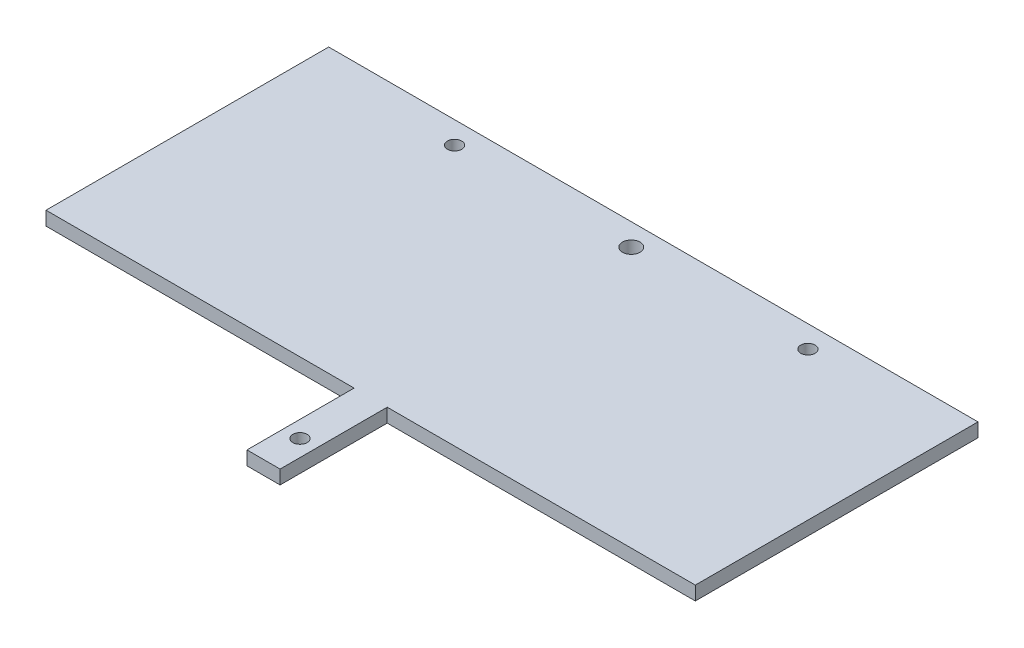
ISO-10303-21;
HEADER;
FILE_DESCRIPTION(('STEP AP214'),'2;1');
FILE_NAME('part.step','',(''),(''),'','','');
FILE_SCHEMA(('AUTOMOTIVE_DESIGN { 1 0 10303 214 1 1 1 1 }'));
ENDSEC;
DATA;
#1=APPLICATION_CONTEXT('core data for automotive mechanical design processes');
#2=APPLICATION_PROTOCOL_DEFINITION('international standard','automotive_design',2000,#1);
#3=PRODUCT_CONTEXT('',#1,'mechanical');
#4=PRODUCT('Part','Part','',(#3));
#5=PRODUCT_RELATED_PRODUCT_CATEGORY('part','',(#4));
#6=PRODUCT_DEFINITION_FORMATION('','',#4);
#7=PRODUCT_DEFINITION_CONTEXT('part definition',#1,'design');
#8=PRODUCT_DEFINITION('design','',#6,#7);
#9=PRODUCT_DEFINITION_SHAPE('','',#8);
#10=(LENGTH_UNIT() NAMED_UNIT(*) SI_UNIT(.MILLI.,.METRE.));
#11=(NAMED_UNIT(*) PLANE_ANGLE_UNIT() SI_UNIT($,.RADIAN.));
#12=(NAMED_UNIT(*) SI_UNIT($,.STERADIAN.) SOLID_ANGLE_UNIT());
#13=UNCERTAINTY_MEASURE_WITH_UNIT(LENGTH_MEASURE(1.E-05),#10,'distance_accuracy_value','');
#14=(GEOMETRIC_REPRESENTATION_CONTEXT(3) GLOBAL_UNCERTAINTY_ASSIGNED_CONTEXT((#13)) GLOBAL_UNIT_ASSIGNED_CONTEXT((#10,
#11,#12)) REPRESENTATION_CONTEXT('',''));
#15=CARTESIAN_POINT('',(0.,0.,0.));
#16=DIRECTION('',(0.,0.,1.));
#17=DIRECTION('',(1.,0.,0.));
#18=AXIS2_PLACEMENT_3D('',#15,#16,#17);
#19=CARTESIAN_POINT('',(-74.676,-3.175,-41.402));
#20=DIRECTION('',(-1.,0.,0.));
#21=DIRECTION('',(0.,0.,1.));
#22=AXIS2_PLACEMENT_3D('',#19,#20,#21);
#23=PLANE('',#22);
#24=DIRECTION('',(0.,0.,1.));
#25=VECTOR('',#24,1.);
#26=CARTESIAN_POINT('',(-74.676,0.,-41.402));
#27=LINE('',#26,#25);
#28=CARTESIAN_POINT('',(-74.676,0.,-41.402));
#29=VERTEX_POINT('',#28);
#30=CARTESIAN_POINT('',(-74.676,0.,23.622));
#31=VERTEX_POINT('',#30);
#32=EDGE_CURVE('E130',#29,#31,#27,.T.);
#33=ORIENTED_EDGE('',*,*,#32,.F.);
#34=DIRECTION('',(0.,1.,0.));
#35=VECTOR('',#34,1.);
#36=CARTESIAN_POINT('',(-74.676,-3.175,-41.402));
#37=LINE('',#36,#35);
#38=CARTESIAN_POINT('',(-74.676,-3.175,-41.402));
#39=VERTEX_POINT('',#38);
#40=EDGE_CURVE('E11',#39,#29,#37,.T.);
#41=ORIENTED_EDGE('',*,*,#40,.F.);
#42=DIRECTION('',(0.,0.,1.));
#43=VECTOR('',#42,1.);
#44=CARTESIAN_POINT('',(-74.676,-3.175,-41.402));
#45=LINE('',#44,#43);
#46=CARTESIAN_POINT('',(-74.676,-3.175,23.622));
#47=VERTEX_POINT('',#46);
#48=EDGE_CURVE('E151',#39,#47,#45,.T.);
#49=ORIENTED_EDGE('',*,*,#48,.T.);
#50=DIRECTION('',(0.,1.,0.));
#51=VECTOR('',#50,1.);
#52=CARTESIAN_POINT('',(-74.676,-3.175,23.622));
#53=LINE('',#52,#51);
#54=EDGE_CURVE('E36',#47,#31,#53,.T.);
#55=ORIENTED_EDGE('',*,*,#54,.T.);
#56=EDGE_LOOP('',(#33,#41,#49,#55));
#57=FACE_BOUND('',#56,.T.);
#58=ADVANCED_FACE('F33',(#57),#23,.T.);
#59=CARTESIAN_POINT('',(-74.676,-3.175,-41.402));
#60=DIRECTION('',(0.,0.,-1.));
#61=DIRECTION('',(-1.,0.,0.));
#62=AXIS2_PLACEMENT_3D('',#59,#60,#61);
#63=PLANE('',#62);
#64=DIRECTION('',(-1.,0.,0.));
#65=VECTOR('',#64,1.);
#66=CARTESIAN_POINT('',(-74.676,0.,-41.402));
#67=LINE('',#66,#65);
#68=CARTESIAN_POINT('',(74.676,0.,-41.402));
#69=VERTEX_POINT('',#68);
#70=EDGE_CURVE('E149',#69,#29,#67,.T.);
#71=ORIENTED_EDGE('',*,*,#70,.F.);
#72=DIRECTION('',(0.,1.,0.));
#73=VECTOR('',#72,1.);
#74=CARTESIAN_POINT('',(74.676,-3.175,-41.402));
#75=LINE('',#74,#73);
#76=CARTESIAN_POINT('',(74.676,-3.175,-41.402));
#77=VERTEX_POINT('',#76);
#78=EDGE_CURVE('E42',#77,#69,#75,.T.);
#79=ORIENTED_EDGE('',*,*,#78,.F.);
#80=DIRECTION('',(-1.,0.,0.));
#81=VECTOR('',#80,1.);
#82=CARTESIAN_POINT('',(-74.676,-3.175,-41.402));
#83=LINE('',#82,#81);
#84=EDGE_CURVE('E120',#77,#39,#83,.T.);
#85=ORIENTED_EDGE('',*,*,#84,.T.);
#86=ORIENTED_EDGE('',*,*,#40,.T.);
#87=EDGE_LOOP('',(#71,#79,#85,#86));
#88=FACE_BOUND('',#87,.T.);
#89=ADVANCED_FACE('F163',(#88),#63,.T.);
#90=CARTESIAN_POINT('',(74.676,-3.175,-41.402));
#91=DIRECTION('',(1.,0.,0.));
#92=DIRECTION('',(0.,0.,-1.));
#93=AXIS2_PLACEMENT_3D('',#90,#91,#92);
#94=PLANE('',#93);
#95=DIRECTION('',(0.,0.,-1.));
#96=VECTOR('',#95,1.);
#97=CARTESIAN_POINT('',(74.676,0.,-41.402));
#98=LINE('',#97,#96);
#99=CARTESIAN_POINT('',(74.676,0.,23.622));
#100=VERTEX_POINT('',#99);
#101=EDGE_CURVE('E107',#100,#69,#98,.T.);
#102=ORIENTED_EDGE('',*,*,#101,.F.);
#103=DIRECTION('',(0.,1.,0.));
#104=VECTOR('',#103,1.);
#105=CARTESIAN_POINT('',(74.676,-3.175,23.622));
#106=LINE('',#105,#104);
#107=CARTESIAN_POINT('',(74.676,-3.175,23.622));
#108=VERTEX_POINT('',#107);
#109=EDGE_CURVE('E102',#108,#100,#106,.T.);
#110=ORIENTED_EDGE('',*,*,#109,.F.);
#111=DIRECTION('',(0.,0.,-1.));
#112=VECTOR('',#111,1.);
#113=CARTESIAN_POINT('',(74.676,-3.175,-41.402));
#114=LINE('',#113,#112);
#115=EDGE_CURVE('E105',#108,#77,#114,.T.);
#116=ORIENTED_EDGE('',*,*,#115,.T.);
#117=ORIENTED_EDGE('',*,*,#78,.T.);
#118=EDGE_LOOP('',(#102,#110,#116,#117));
#119=FACE_BOUND('',#118,.T.);
#120=ADVANCED_FACE('F104',(#119),#94,.T.);
#121=CARTESIAN_POINT('',(3.81000000000001,-3.175,23.622));
#122=DIRECTION('',(0.,0.,1.));
#123=DIRECTION('',(1.,0.,0.));
#124=AXIS2_PLACEMENT_3D('',#121,#122,#123);
#125=PLANE('',#124);
#126=DIRECTION('',(1.,0.,0.));
#127=VECTOR('',#126,1.);
#128=CARTESIAN_POINT('',(3.81000000000001,0.,23.622));
#129=LINE('',#128,#127);
#130=CARTESIAN_POINT('',(3.81000000000001,0.,23.622));
#131=VERTEX_POINT('',#130);
#132=EDGE_CURVE('E146',#131,#100,#129,.T.);
#133=ORIENTED_EDGE('',*,*,#132,.F.);
#134=DIRECTION('',(0.,1.,0.));
#135=VECTOR('',#134,1.);
#136=CARTESIAN_POINT('',(3.81000000000001,-3.175,23.622));
#137=LINE('',#136,#135);
#138=CARTESIAN_POINT('',(3.81000000000001,-3.175,23.622));
#139=VERTEX_POINT('',#138);
#140=EDGE_CURVE('E112',#139,#131,#137,.T.);
#141=ORIENTED_EDGE('',*,*,#140,.F.);
#142=DIRECTION('',(1.,0.,0.));
#143=VECTOR('',#142,1.);
#144=CARTESIAN_POINT('',(3.81000000000001,-3.175,23.622));
#145=LINE('',#144,#143);
#146=EDGE_CURVE('E118',#139,#108,#145,.T.);
#147=ORIENTED_EDGE('',*,*,#146,.T.);
#148=ORIENTED_EDGE('',*,*,#109,.T.);
#149=EDGE_LOOP('',(#133,#141,#147,#148));
#150=FACE_BOUND('',#149,.T.);
#151=ADVANCED_FACE('F122',(#150),#125,.T.);
#152=CARTESIAN_POINT('',(3.81,-3.175,48.26));
#153=DIRECTION('',(1.,0.,0.));
#154=DIRECTION('',(0.,0.,-1.));
#155=AXIS2_PLACEMENT_3D('',#152,#153,#154);
#156=PLANE('',#155);
#157=DIRECTION('',(0.,0.,-1.));
#158=VECTOR('',#157,1.);
#159=CARTESIAN_POINT('',(3.81,0.,48.26));
#160=LINE('',#159,#158);
#161=CARTESIAN_POINT('',(3.81,0.,48.26));
#162=VERTEX_POINT('',#161);
#163=EDGE_CURVE('E143',#162,#131,#160,.T.);
#164=ORIENTED_EDGE('',*,*,#163,.F.);
#165=DIRECTION('',(0.,1.,0.));
#166=VECTOR('',#165,1.);
#167=CARTESIAN_POINT('',(3.81,-3.175,48.26));
#168=LINE('',#167,#166);
#169=CARTESIAN_POINT('',(3.81,-3.175,48.26));
#170=VERTEX_POINT('',#169);
#171=EDGE_CURVE('E155',#170,#162,#168,.T.);
#172=ORIENTED_EDGE('',*,*,#171,.F.);
#173=DIRECTION('',(0.,0.,-1.));
#174=VECTOR('',#173,1.);
#175=CARTESIAN_POINT('',(3.81,-3.175,48.26));
#176=LINE('',#175,#174);
#177=EDGE_CURVE('E123',#170,#139,#176,.T.);
#178=ORIENTED_EDGE('',*,*,#177,.T.);
#179=ORIENTED_EDGE('',*,*,#140,.T.);
#180=EDGE_LOOP('',(#164,#172,#178,#179));
#181=FACE_BOUND('',#180,.T.);
#182=ADVANCED_FACE('F176',(#181),#156,.T.);
#183=CARTESIAN_POINT('',(-3.81,-3.175,48.26));
#184=DIRECTION('',(0.,0.,1.));
#185=DIRECTION('',(1.,0.,0.));
#186=AXIS2_PLACEMENT_3D('',#183,#184,#185);
#187=PLANE('',#186);
#188=DIRECTION('',(1.,0.,0.));
#189=VECTOR('',#188,1.);
#190=CARTESIAN_POINT('',(-3.81,0.,48.26));
#191=LINE('',#190,#189);
#192=CARTESIAN_POINT('',(-3.81,0.,48.26));
#193=VERTEX_POINT('',#192);
#194=EDGE_CURVE('E140',#193,#162,#191,.T.);
#195=ORIENTED_EDGE('',*,*,#194,.F.);
#196=DIRECTION('',(0.,1.,0.));
#197=VECTOR('',#196,1.);
#198=CARTESIAN_POINT('',(-3.81,-3.175,48.26));
#199=LINE('',#198,#197);
#200=CARTESIAN_POINT('',(-3.81,-3.175,48.26));
#201=VERTEX_POINT('',#200);
#202=EDGE_CURVE('E157',#201,#193,#199,.T.);
#203=ORIENTED_EDGE('',*,*,#202,.F.);
#204=DIRECTION('',(1.,0.,0.));
#205=VECTOR('',#204,1.);
#206=CARTESIAN_POINT('',(-3.81,-3.175,48.26));
#207=LINE('',#206,#205);
#208=EDGE_CURVE('E125',#201,#170,#207,.T.);
#209=ORIENTED_EDGE('',*,*,#208,.T.);
#210=ORIENTED_EDGE('',*,*,#171,.T.);
#211=EDGE_LOOP('',(#195,#203,#209,#210));
#212=FACE_BOUND('',#211,.T.);
#213=ADVANCED_FACE('F179',(#212),#187,.T.);
#214=CARTESIAN_POINT('',(-3.81000000000001,-3.175,23.622));
#215=DIRECTION('',(-1.,0.,0.));
#216=DIRECTION('',(0.,0.,1.));
#217=AXIS2_PLACEMENT_3D('',#214,#215,#216);
#218=PLANE('',#217);
#219=DIRECTION('',(0.,0.,1.));
#220=VECTOR('',#219,1.);
#221=CARTESIAN_POINT('',(-3.81000000000001,0.,23.622));
#222=LINE('',#221,#220);
#223=CARTESIAN_POINT('',(-3.81000000000001,0.,23.622));
#224=VERTEX_POINT('',#223);
#225=EDGE_CURVE('E137',#224,#193,#222,.T.);
#226=ORIENTED_EDGE('',*,*,#225,.F.);
#227=DIRECTION('',(0.,1.,0.));
#228=VECTOR('',#227,1.);
#229=CARTESIAN_POINT('',(-3.81000000000001,-3.175,23.622));
#230=LINE('',#229,#228);
#231=CARTESIAN_POINT('',(-3.81000000000001,-3.175,23.622));
#232=VERTEX_POINT('',#231);
#233=EDGE_CURVE('E158',#232,#224,#230,.T.);
#234=ORIENTED_EDGE('',*,*,#233,.F.);
#235=DIRECTION('',(0.,0.,1.));
#236=VECTOR('',#235,1.);
#237=CARTESIAN_POINT('',(-3.81000000000001,-3.175,23.622));
#238=LINE('',#237,#236);
#239=EDGE_CURVE('E245',#232,#201,#238,.T.);
#240=ORIENTED_EDGE('',*,*,#239,.T.);
#241=ORIENTED_EDGE('',*,*,#202,.T.);
#242=EDGE_LOOP('',(#226,#234,#240,#241));
#243=FACE_BOUND('',#242,.T.);
#244=ADVANCED_FACE('F183',(#243),#218,.T.);
#245=CARTESIAN_POINT('',(-74.676,-3.175,23.622));
#246=DIRECTION('',(0.,0.,1.));
#247=DIRECTION('',(1.,0.,0.));
#248=AXIS2_PLACEMENT_3D('',#245,#246,#247);
#249=PLANE('',#248);
#250=DIRECTION('',(1.,0.,0.));
#251=VECTOR('',#250,1.);
#252=CARTESIAN_POINT('',(-74.676,0.,23.622));
#253=LINE('',#252,#251);
#254=EDGE_CURVE('E133',#31,#224,#253,.T.);
#255=ORIENTED_EDGE('',*,*,#254,.F.);
#256=ORIENTED_EDGE('',*,*,#54,.F.);
#257=DIRECTION('',(1.,0.,0.));
#258=VECTOR('',#257,1.);
#259=CARTESIAN_POINT('',(-74.676,-3.175,23.622));
#260=LINE('',#259,#258);
#261=EDGE_CURVE('E243',#47,#232,#260,.T.);
#262=ORIENTED_EDGE('',*,*,#261,.T.);
#263=ORIENTED_EDGE('',*,*,#233,.T.);
#264=EDGE_LOOP('',(#255,#256,#262,#263));
#265=FACE_BOUND('',#264,.T.);
#266=ADVANCED_FACE('F160',(#265),#249,.T.);
#267=CARTESIAN_POINT('',(0.,-3.175,0.));
#268=DIRECTION('',(0.,1.,0.));
#269=DIRECTION('',(0.,0.,1.));
#270=AXIS2_PLACEMENT_3D('',#267,#268,#269);
#271=PLANE('',#270);
#272=CARTESIAN_POINT('',(0.,-3.175,39.878));
#273=DIRECTION('',(0.,1.,0.));
#274=DIRECTION('',(0.,0.,1.));
#275=AXIS2_PLACEMENT_3D('',#272,#273,#274);
#276=CIRCLE('',#275,1.651);
#277=CARTESIAN_POINT('',(0.,-3.175,41.529));
#278=VERTEX_POINT('',#277);
#279=EDGE_CURVE('E218',#278,#278,#276,.T.);
#280=ORIENTED_EDGE('',*,*,#279,.T.);
#281=EDGE_LOOP('',(#280));
#282=FACE_BOUND('',#281,.T.);
#283=CARTESIAN_POINT('',(40.64,-3.175,-36.322));
#284=DIRECTION('',(0.,1.,0.));
#285=DIRECTION('',(0.,0.,1.));
#286=AXIS2_PLACEMENT_3D('',#283,#284,#285);
#287=CIRCLE('',#286,1.651);
#288=CARTESIAN_POINT('',(40.64,-3.175,-34.671));
#289=VERTEX_POINT('',#288);
#290=EDGE_CURVE('E226',#289,#289,#287,.T.);
#291=ORIENTED_EDGE('',*,*,#290,.T.);
#292=EDGE_LOOP('',(#291));
#293=FACE_BOUND('',#292,.T.);
#294=CARTESIAN_POINT('',(0.,-3.175,-36.322));
#295=DIRECTION('',(0.,1.,0.));
#296=DIRECTION('',(0.,0.,1.));
#297=AXIS2_PLACEMENT_3D('',#294,#295,#296);
#298=CIRCLE('',#297,2.032);
#299=CARTESIAN_POINT('',(0.,-3.175,-34.29));
#300=VERTEX_POINT('',#299);
#301=EDGE_CURVE('E232',#300,#300,#298,.T.);
#302=ORIENTED_EDGE('',*,*,#301,.T.);
#303=EDGE_LOOP('',(#302));
#304=FACE_BOUND('',#303,.T.);
#305=CARTESIAN_POINT('',(-40.64,-3.175,-36.322));
#306=DIRECTION('',(0.,1.,0.));
#307=DIRECTION('',(0.,0.,1.));
#308=AXIS2_PLACEMENT_3D('',#305,#306,#307);
#309=CIRCLE('',#308,1.651);
#310=CARTESIAN_POINT('',(-40.64,-3.175,-34.671));
#311=VERTEX_POINT('',#310);
#312=EDGE_CURVE('E134',#311,#311,#309,.T.);
#313=ORIENTED_EDGE('',*,*,#312,.T.);
#314=EDGE_LOOP('',(#313));
#315=FACE_BOUND('',#314,.T.);
#316=ORIENTED_EDGE('',*,*,#48,.F.);
#317=ORIENTED_EDGE('',*,*,#84,.F.);
#318=ORIENTED_EDGE('',*,*,#115,.F.);
#319=ORIENTED_EDGE('',*,*,#146,.F.);
#320=ORIENTED_EDGE('',*,*,#177,.F.);
#321=ORIENTED_EDGE('',*,*,#208,.F.);
#322=ORIENTED_EDGE('',*,*,#239,.F.);
#323=ORIENTED_EDGE('',*,*,#261,.F.);
#324=EDGE_LOOP('',(#316,#317,#318,#319,#320,#321,#322,#323));
#325=FACE_BOUND('',#324,.T.);
#326=ADVANCED_FACE('F116',(#282,#293,#304,#315,#325),#271,.F.);
#327=CARTESIAN_POINT('',(0.,0.,0.));
#328=DIRECTION('',(0.,1.,0.));
#329=DIRECTION('',(0.,0.,1.));
#330=AXIS2_PLACEMENT_3D('',#327,#328,#329);
#331=PLANE('',#330);
#332=CARTESIAN_POINT('',(0.,0.,39.878));
#333=DIRECTION('',(0.,1.,0.));
#334=DIRECTION('',(0.,0.,1.));
#335=AXIS2_PLACEMENT_3D('',#332,#333,#334);
#336=CIRCLE('',#335,1.651);
#337=CARTESIAN_POINT('',(0.,0.,41.529));
#338=VERTEX_POINT('',#337);
#339=EDGE_CURVE('E221',#338,#338,#336,.T.);
#340=ORIENTED_EDGE('',*,*,#339,.F.);
#341=EDGE_LOOP('',(#340));
#342=FACE_BOUND('',#341,.T.);
#343=CARTESIAN_POINT('',(40.64,0.,-36.322));
#344=DIRECTION('',(0.,1.,0.));
#345=DIRECTION('',(0.,0.,1.));
#346=AXIS2_PLACEMENT_3D('',#343,#344,#345);
#347=CIRCLE('',#346,1.651);
#348=CARTESIAN_POINT('',(40.64,0.,-34.671));
#349=VERTEX_POINT('',#348);
#350=EDGE_CURVE('E223',#349,#349,#347,.T.);
#351=ORIENTED_EDGE('',*,*,#350,.F.);
#352=EDGE_LOOP('',(#351));
#353=FACE_BOUND('',#352,.T.);
#354=CARTESIAN_POINT('',(0.,0.,-36.322));
#355=DIRECTION('',(0.,1.,0.));
#356=DIRECTION('',(0.,0.,1.));
#357=AXIS2_PLACEMENT_3D('',#354,#355,#356);
#358=CIRCLE('',#357,2.032);
#359=CARTESIAN_POINT('',(0.,0.,-34.29));
#360=VERTEX_POINT('',#359);
#361=EDGE_CURVE('E229',#360,#360,#358,.T.);
#362=ORIENTED_EDGE('',*,*,#361,.F.);
#363=EDGE_LOOP('',(#362));
#364=FACE_BOUND('',#363,.T.);
#365=CARTESIAN_POINT('',(-40.64,0.,-36.322));
#366=DIRECTION('',(0.,1.,0.));
#367=DIRECTION('',(0.,0.,1.));
#368=AXIS2_PLACEMENT_3D('',#365,#366,#367);
#369=CIRCLE('',#368,1.651);
#370=CARTESIAN_POINT('',(-40.64,0.,-34.671));
#371=VERTEX_POINT('',#370);
#372=EDGE_CURVE('E235',#371,#371,#369,.T.);
#373=ORIENTED_EDGE('',*,*,#372,.F.);
#374=EDGE_LOOP('',(#373));
#375=FACE_BOUND('',#374,.T.);
#376=ORIENTED_EDGE('',*,*,#32,.T.);
#377=ORIENTED_EDGE('',*,*,#254,.T.);
#378=ORIENTED_EDGE('',*,*,#225,.T.);
#379=ORIENTED_EDGE('',*,*,#194,.T.);
#380=ORIENTED_EDGE('',*,*,#163,.T.);
#381=ORIENTED_EDGE('',*,*,#132,.T.);
#382=ORIENTED_EDGE('',*,*,#101,.T.);
#383=ORIENTED_EDGE('',*,*,#70,.T.);
#384=EDGE_LOOP('',(#376,#377,#378,#379,#380,#381,#382,#383));
#385=FACE_BOUND('',#384,.T.);
#386=ADVANCED_FACE('F162',(#342,#353,#364,#375,#385),#331,.T.);
#387=CARTESIAN_POINT('',(-40.64,-3.175,-36.322));
#388=DIRECTION('',(0.,1.,0.));
#389=DIRECTION('',(0.,0.,1.));
#390=AXIS2_PLACEMENT_3D('',#387,#388,#389);
#391=CYLINDRICAL_SURFACE('',#390,1.651);
#392=ORIENTED_EDGE('',*,*,#312,.F.);
#393=EDGE_LOOP('',(#392));
#394=FACE_BOUND('',#393,.T.);
#395=ORIENTED_EDGE('',*,*,#372,.T.);
#396=EDGE_LOOP('',(#395));
#397=FACE_BOUND('',#396,.T.);
#398=ADVANCED_FACE('F195',(#394,#397),#391,.F.);
#399=CARTESIAN_POINT('',(0.,-3.175,-36.322));
#400=DIRECTION('',(0.,1.,0.));
#401=DIRECTION('',(0.,0.,1.));
#402=AXIS2_PLACEMENT_3D('',#399,#400,#401);
#403=CYLINDRICAL_SURFACE('',#402,2.032);
#404=ORIENTED_EDGE('',*,*,#301,.F.);
#405=EDGE_LOOP('',(#404));
#406=FACE_BOUND('',#405,.T.);
#407=ORIENTED_EDGE('',*,*,#361,.T.);
#408=EDGE_LOOP('',(#407));
#409=FACE_BOUND('',#408,.T.);
#410=ADVANCED_FACE('F202',(#406,#409),#403,.F.);
#411=CARTESIAN_POINT('',(40.64,-3.175,-36.322));
#412=DIRECTION('',(0.,1.,0.));
#413=DIRECTION('',(0.,0.,1.));
#414=AXIS2_PLACEMENT_3D('',#411,#412,#413);
#415=CYLINDRICAL_SURFACE('',#414,1.651);
#416=ORIENTED_EDGE('',*,*,#290,.F.);
#417=EDGE_LOOP('',(#416));
#418=FACE_BOUND('',#417,.T.);
#419=ORIENTED_EDGE('',*,*,#350,.T.);
#420=EDGE_LOOP('',(#419));
#421=FACE_BOUND('',#420,.T.);
#422=ADVANCED_FACE('F206',(#418,#421),#415,.F.);
#423=CARTESIAN_POINT('',(0.,-3.175,39.878));
#424=DIRECTION('',(0.,1.,0.));
#425=DIRECTION('',(0.,0.,1.));
#426=AXIS2_PLACEMENT_3D('',#423,#424,#425);
#427=CYLINDRICAL_SURFACE('',#426,1.651);
#428=ORIENTED_EDGE('',*,*,#279,.F.);
#429=EDGE_LOOP('',(#428));
#430=FACE_BOUND('',#429,.T.);
#431=ORIENTED_EDGE('',*,*,#339,.T.);
#432=EDGE_LOOP('',(#431));
#433=FACE_BOUND('',#432,.T.);
#434=ADVANCED_FACE('F210',(#430,#433),#427,.F.);
#435=CLOSED_SHELL('',(#58,#89,#120,#151,#182,#213,#244,#266,#326,#386,#398,#410,#422,#434));
#436=MANIFOLD_SOLID_BREP('B2',#435);
#437=ADVANCED_BREP_SHAPE_REPRESENTATION('',(#18,#436),#14);
#438=SHAPE_DEFINITION_REPRESENTATION(#9,#437);
ENDSEC;
END-ISO-10303-21;
